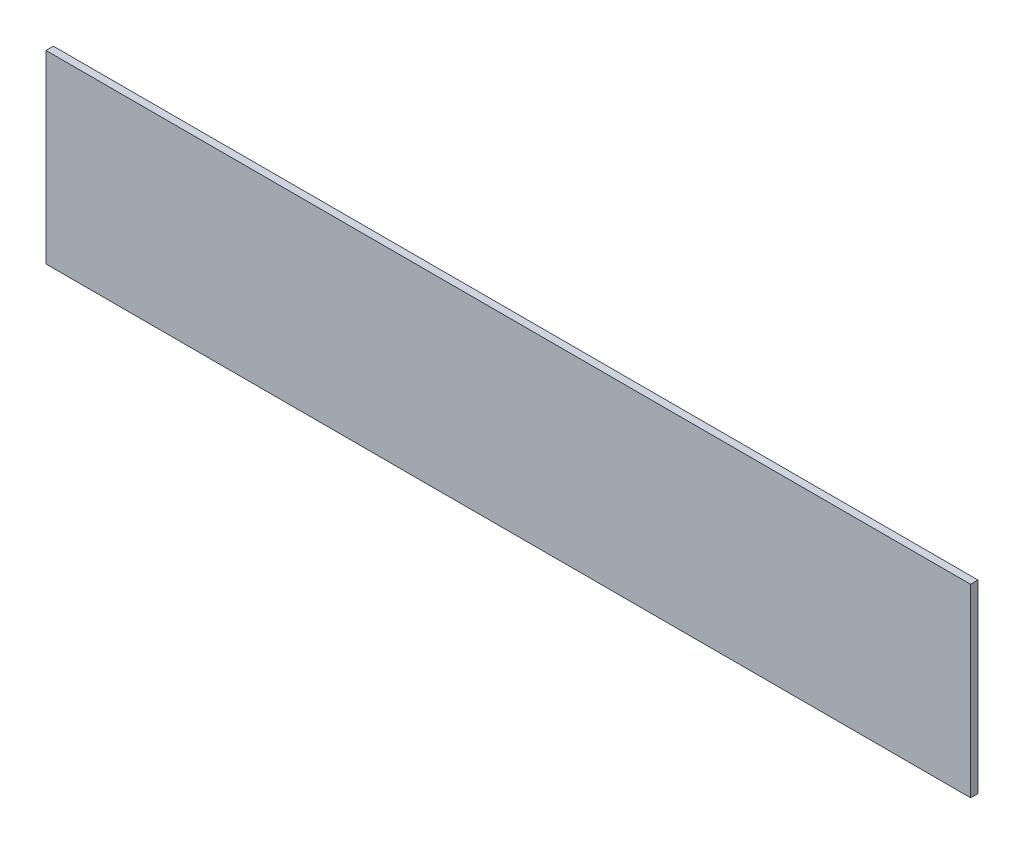
ISO-10303-21;
HEADER;
FILE_DESCRIPTION(('STEP AP214'),'2;1');
FILE_NAME('part.step','',(''),(''),'','','');
FILE_SCHEMA(('AUTOMOTIVE_DESIGN { 1 0 10303 214 1 1 1 1 }'));
ENDSEC;
DATA;
#1=APPLICATION_CONTEXT('core data for automotive mechanical design processes');
#2=APPLICATION_PROTOCOL_DEFINITION('international standard','automotive_design',2000,#1);
#3=PRODUCT_CONTEXT('',#1,'mechanical');
#4=PRODUCT('Part','Part','',(#3));
#5=PRODUCT_RELATED_PRODUCT_CATEGORY('part','',(#4));
#6=PRODUCT_DEFINITION_FORMATION('','',#4);
#7=PRODUCT_DEFINITION_CONTEXT('part definition',#1,'design');
#8=PRODUCT_DEFINITION('design','',#6,#7);
#9=PRODUCT_DEFINITION_SHAPE('','',#8);
#10=(LENGTH_UNIT() NAMED_UNIT(*) SI_UNIT(.MILLI.,.METRE.));
#11=(NAMED_UNIT(*) PLANE_ANGLE_UNIT() SI_UNIT($,.RADIAN.));
#12=(NAMED_UNIT(*) SI_UNIT($,.STERADIAN.) SOLID_ANGLE_UNIT());
#13=UNCERTAINTY_MEASURE_WITH_UNIT(LENGTH_MEASURE(1.E-05),#10,'distance_accuracy_value','');
#14=(GEOMETRIC_REPRESENTATION_CONTEXT(3) GLOBAL_UNCERTAINTY_ASSIGNED_CONTEXT((#13)) GLOBAL_UNIT_ASSIGNED_CONTEXT((#10,
#11,#12)) REPRESENTATION_CONTEXT('',''));
#15=CARTESIAN_POINT('',(0.,0.,0.));
#16=DIRECTION('',(0.,0.,1.));
#17=DIRECTION('',(1.,0.,0.));
#18=AXIS2_PLACEMENT_3D('',#15,#16,#17);
#19=CARTESIAN_POINT('',(12.5,-2.5,0.2));
#20=DIRECTION('',(-1.,0.,0.));
#21=DIRECTION('',(0.,0.,1.));
#22=AXIS2_PLACEMENT_3D('',#19,#20,#21);
#23=PLANE('',#22);
#24=DIRECTION('',(0.,1.,0.));
#25=VECTOR('',#24,1.);
#26=CARTESIAN_POINT('',(12.5,-2.5,0.));
#27=LINE('',#26,#25);
#28=CARTESIAN_POINT('',(12.5,-2.5,0.));
#29=VERTEX_POINT('',#28);
#30=CARTESIAN_POINT('',(12.5,2.5,0.));
#31=VERTEX_POINT('',#30);
#32=EDGE_CURVE('E111',#29,#31,#27,.T.);
#33=ORIENTED_EDGE('',*,*,#32,.T.);
#34=DIRECTION('',(0.,0.,-1.));
#35=VECTOR('',#34,1.);
#36=CARTESIAN_POINT('',(12.5,2.5,0.2));
#37=LINE('',#36,#35);
#38=CARTESIAN_POINT('',(12.5,2.5,0.2));
#39=VERTEX_POINT('',#38);
#40=EDGE_CURVE('E11',#39,#31,#37,.T.);
#41=ORIENTED_EDGE('',*,*,#40,.F.);
#42=DIRECTION('',(0.,1.,0.));
#43=VECTOR('',#42,1.);
#44=CARTESIAN_POINT('',(12.5,-2.5,0.2));
#45=LINE('',#44,#43);
#46=CARTESIAN_POINT('',(12.5,-2.5,0.2));
#47=VERTEX_POINT('',#46);
#48=EDGE_CURVE('E95',#47,#39,#45,.T.);
#49=ORIENTED_EDGE('',*,*,#48,.F.);
#50=DIRECTION('',(0.,0.,-1.));
#51=VECTOR('',#50,1.);
#52=CARTESIAN_POINT('',(12.5,-2.5,0.2));
#53=LINE('',#52,#51);
#54=EDGE_CURVE('E107',#47,#29,#53,.T.);
#55=ORIENTED_EDGE('',*,*,#54,.T.);
#56=EDGE_LOOP('',(#33,#41,#49,#55));
#57=FACE_BOUND('',#56,.T.);
#58=ADVANCED_FACE('F43',(#57),#23,.F.);
#59=CARTESIAN_POINT('',(-12.5,2.5,0.2));
#60=DIRECTION('',(0.,-1.,0.));
#61=DIRECTION('',(0.,0.,-1.));
#62=AXIS2_PLACEMENT_3D('',#59,#60,#61);
#63=PLANE('',#62);
#64=DIRECTION('',(-1.,0.,0.));
#65=VECTOR('',#64,1.);
#66=CARTESIAN_POINT('',(-12.5,2.5,0.));
#67=LINE('',#66,#65);
#68=CARTESIAN_POINT('',(-12.5,2.5,0.));
#69=VERTEX_POINT('',#68);
#70=EDGE_CURVE('E100',#31,#69,#67,.T.);
#71=ORIENTED_EDGE('',*,*,#70,.T.);
#72=DIRECTION('',(0.,0.,-1.));
#73=VECTOR('',#72,1.);
#74=CARTESIAN_POINT('',(-12.5,2.5,0.2));
#75=LINE('',#74,#73);
#76=CARTESIAN_POINT('',(-12.5,2.5,0.2));
#77=VERTEX_POINT('',#76);
#78=EDGE_CURVE('E52',#77,#69,#75,.T.);
#79=ORIENTED_EDGE('',*,*,#78,.F.);
#80=DIRECTION('',(-1.,0.,0.));
#81=VECTOR('',#80,1.);
#82=CARTESIAN_POINT('',(-12.5,2.5,0.2));
#83=LINE('',#82,#81);
#84=EDGE_CURVE('E90',#39,#77,#83,.T.);
#85=ORIENTED_EDGE('',*,*,#84,.F.);
#86=ORIENTED_EDGE('',*,*,#40,.T.);
#87=EDGE_LOOP('',(#71,#79,#85,#86));
#88=FACE_BOUND('',#87,.T.);
#89=ADVANCED_FACE('F99',(#88),#63,.F.);
#90=CARTESIAN_POINT('',(-12.5,-2.5,0.2));
#91=DIRECTION('',(1.,0.,0.));
#92=DIRECTION('',(0.,0.,-1.));
#93=AXIS2_PLACEMENT_3D('',#90,#91,#92);
#94=PLANE('',#93);
#95=DIRECTION('',(0.,-1.,0.));
#96=VECTOR('',#95,1.);
#97=CARTESIAN_POINT('',(-12.5,-2.5,0.));
#98=LINE('',#97,#96);
#99=CARTESIAN_POINT('',(-12.5,-2.5,0.));
#100=VERTEX_POINT('',#99);
#101=EDGE_CURVE('E77',#69,#100,#98,.T.);
#102=ORIENTED_EDGE('',*,*,#101,.T.);
#103=DIRECTION('',(0.,0.,-1.));
#104=VECTOR('',#103,1.);
#105=CARTESIAN_POINT('',(-12.5,-2.5,0.2));
#106=LINE('',#105,#104);
#107=CARTESIAN_POINT('',(-12.5,-2.5,0.2));
#108=VERTEX_POINT('',#107);
#109=EDGE_CURVE('E102',#108,#100,#106,.T.);
#110=ORIENTED_EDGE('',*,*,#109,.F.);
#111=DIRECTION('',(0.,-1.,0.));
#112=VECTOR('',#111,1.);
#113=CARTESIAN_POINT('',(-12.5,-2.5,0.2));
#114=LINE('',#113,#112);
#115=EDGE_CURVE('E93',#77,#108,#114,.T.);
#116=ORIENTED_EDGE('',*,*,#115,.F.);
#117=ORIENTED_EDGE('',*,*,#78,.T.);
#118=EDGE_LOOP('',(#102,#110,#116,#117));
#119=FACE_BOUND('',#118,.T.);
#120=ADVANCED_FACE('F103',(#119),#94,.F.);
#121=CARTESIAN_POINT('',(-12.5,-2.5,0.2));
#122=DIRECTION('',(0.,1.,0.));
#123=DIRECTION('',(0.,0.,1.));
#124=AXIS2_PLACEMENT_3D('',#121,#122,#123);
#125=PLANE('',#124);
#126=DIRECTION('',(1.,0.,0.));
#127=VECTOR('',#126,1.);
#128=CARTESIAN_POINT('',(-12.5,-2.5,0.));
#129=LINE('',#128,#127);
#130=EDGE_CURVE('E83',#100,#29,#129,.T.);
#131=ORIENTED_EDGE('',*,*,#130,.T.);
#132=ORIENTED_EDGE('',*,*,#54,.F.);
#133=DIRECTION('',(1.,0.,0.));
#134=VECTOR('',#133,1.);
#135=CARTESIAN_POINT('',(-12.5,-2.5,0.2));
#136=LINE('',#135,#134);
#137=EDGE_CURVE('E60',#108,#47,#136,.T.);
#138=ORIENTED_EDGE('',*,*,#137,.F.);
#139=ORIENTED_EDGE('',*,*,#109,.T.);
#140=EDGE_LOOP('',(#131,#132,#138,#139));
#141=FACE_BOUND('',#140,.T.);
#142=ADVANCED_FACE('F124',(#141),#125,.F.);
#143=CARTESIAN_POINT('',(0.,0.,0.2));
#144=DIRECTION('',(0.,0.,-1.));
#145=DIRECTION('',(-1.,0.,0.));
#146=AXIS2_PLACEMENT_3D('',#143,#144,#145);
#147=PLANE('',#146);
#148=ORIENTED_EDGE('',*,*,#48,.T.);
#149=ORIENTED_EDGE('',*,*,#84,.T.);
#150=ORIENTED_EDGE('',*,*,#115,.T.);
#151=ORIENTED_EDGE('',*,*,#137,.T.);
#152=EDGE_LOOP('',(#148,#149,#150,#151));
#153=FACE_BOUND('',#152,.T.);
#154=ADVANCED_FACE('F91',(#153),#147,.F.);
#155=CARTESIAN_POINT('',(0.,0.,0.));
#156=DIRECTION('',(0.,0.,-1.));
#157=DIRECTION('',(-1.,0.,0.));
#158=AXIS2_PLACEMENT_3D('',#155,#156,#157);
#159=PLANE('',#158);
#160=ORIENTED_EDGE('',*,*,#32,.F.);
#161=ORIENTED_EDGE('',*,*,#130,.F.);
#162=ORIENTED_EDGE('',*,*,#101,.F.);
#163=ORIENTED_EDGE('',*,*,#70,.F.);
#164=EDGE_LOOP('',(#160,#161,#162,#163));
#165=FACE_BOUND('',#164,.T.);
#166=ADVANCED_FACE('F127',(#165),#159,.T.);
#167=CLOSED_SHELL('',(#58,#89,#120,#142,#154,#166));
#168=MANIFOLD_SOLID_BREP('B2',#167);
#169=ADVANCED_BREP_SHAPE_REPRESENTATION('',(#18,#168),#14);
#170=SHAPE_DEFINITION_REPRESENTATION(#9,#169);
ENDSEC;
END-ISO-10303-21;
